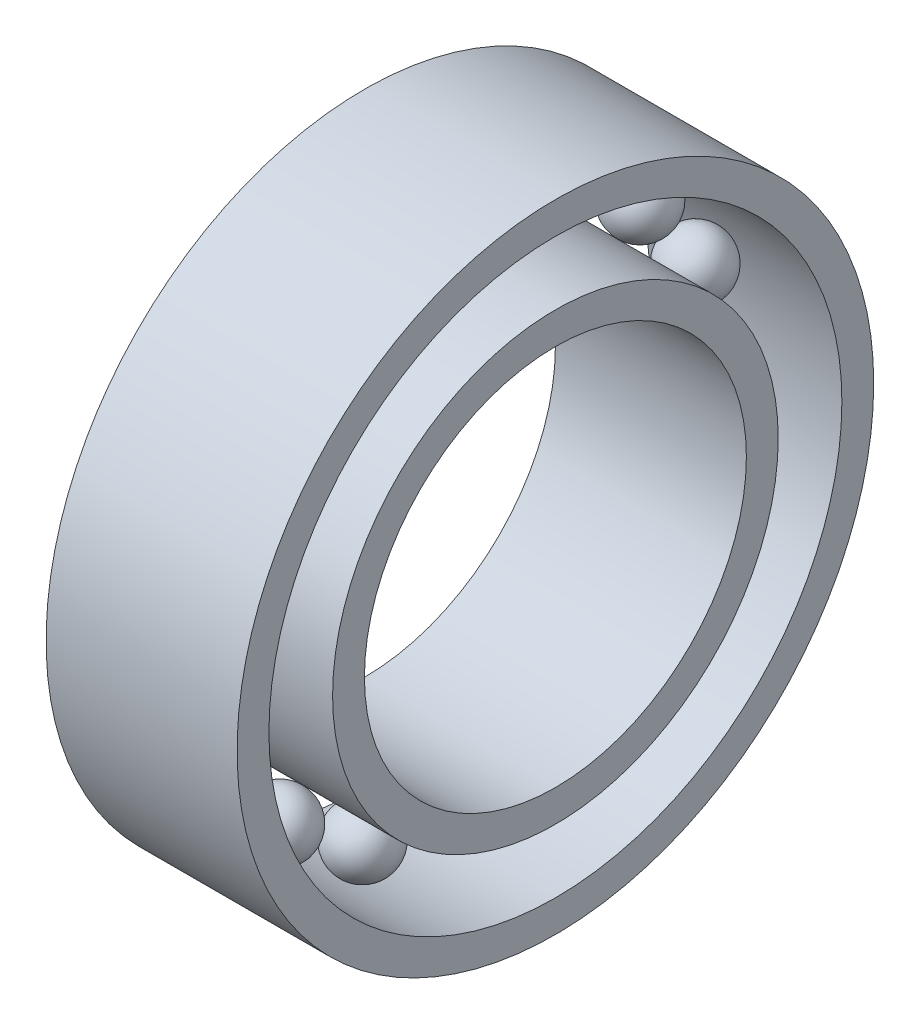
ISO-10303-21;
HEADER;
FILE_DESCRIPTION(('STEP AP214'),'2;1');
FILE_NAME('part.step','',(''),(''),'','','');
FILE_SCHEMA(('AUTOMOTIVE_DESIGN { 1 0 10303 214 1 1 1 1 }'));
ENDSEC;
DATA;
#1=APPLICATION_CONTEXT('core data for automotive mechanical design processes');
#2=APPLICATION_PROTOCOL_DEFINITION('international standard','automotive_design',2000,#1);
#3=PRODUCT_CONTEXT('',#1,'mechanical');
#4=PRODUCT('Part','Part','',(#3));
#5=PRODUCT_RELATED_PRODUCT_CATEGORY('part','',(#4));
#6=PRODUCT_DEFINITION_FORMATION('','',#4);
#7=PRODUCT_DEFINITION_CONTEXT('part definition',#1,'design');
#8=PRODUCT_DEFINITION('design','',#6,#7);
#9=PRODUCT_DEFINITION_SHAPE('','',#8);
#10=(LENGTH_UNIT() NAMED_UNIT(*) SI_UNIT(.MILLI.,.METRE.));
#11=(NAMED_UNIT(*) PLANE_ANGLE_UNIT() SI_UNIT($,.RADIAN.));
#12=(NAMED_UNIT(*) SI_UNIT($,.STERADIAN.) SOLID_ANGLE_UNIT());
#13=UNCERTAINTY_MEASURE_WITH_UNIT(LENGTH_MEASURE(1.E-05),#10,'distance_accuracy_value','');
#14=(GEOMETRIC_REPRESENTATION_CONTEXT(3) GLOBAL_UNCERTAINTY_ASSIGNED_CONTEXT((#13)) GLOBAL_UNIT_ASSIGNED_CONTEXT((#10,
#11,#12)) REPRESENTATION_CONTEXT('',''));
#15=CARTESIAN_POINT('',(0.,0.,0.));
#16=DIRECTION('',(0.,0.,1.));
#17=DIRECTION('',(1.,0.,0.));
#18=AXIS2_PLACEMENT_3D('',#15,#16,#17);
#19=CARTESIAN_POINT('',(0.,3.69551813004517,-1.53073372946031));
#20=DIRECTION('',(0.,-0.923879532511292,0.382683432365077));
#21=DIRECTION('',(0.,0.382683432365077,0.923879532511292));
#22=AXIS2_PLACEMENT_3D('',#19,#20,#21);
#23=SPHERICAL_SURFACE('',#22,0.5);
#24=CARTESIAN_POINT('',(0.,3.23357836378952,-1.33939201327777));
#25=VERTEX_POINT('',#24);
#26=VERTEX_LOOP('',#25);
#27=FACE_BOUND('',#26,.T.);
#28=ADVANCED_FACE('F60',(#27),#23,.T.);
#29=CLOSED_SHELL('',(#28));
#30=MANIFOLD_SOLID_BREP('B2',#29);
#31=CARTESIAN_POINT('',(0.,2.82842712474622,-2.82842712474616));
#32=DIRECTION('',(0.,-0.707106781186556,0.707106781186539));
#33=DIRECTION('',(0.,0.707106781186539,0.707106781186556));
#34=AXIS2_PLACEMENT_3D('',#31,#32,#33);
#35=SPHERICAL_SURFACE('',#34,0.5);
#36=CARTESIAN_POINT('',(0.,2.47487373415295,-2.47487373415289));
#37=VERTEX_POINT('',#36);
#38=VERTEX_LOOP('',#37);
#39=FACE_BOUND('',#38,.T.);
#40=ADVANCED_FACE('F81',(#39),#35,.T.);
#41=CLOSED_SHELL('',(#40));
#42=MANIFOLD_SOLID_BREP('B7',#41);
#43=CARTESIAN_POINT('',(0.,1.5307337294604,-3.69551813004513));
#44=DIRECTION('',(0.,-0.3826834323651,0.923879532511283));
#45=DIRECTION('',(0.,0.923879532511283,0.3826834323651));
#46=AXIS2_PLACEMENT_3D('',#43,#44,#45);
#47=SPHERICAL_SURFACE('',#46,0.5);
#48=CARTESIAN_POINT('',(0.,1.33939201327785,-3.23357836378949));
#49=VERTEX_POINT('',#48);
#50=VERTEX_LOOP('',#49);
#51=FACE_BOUND('',#50,.T.);
#52=ADVANCED_FACE('F99',(#51),#47,.T.);
#53=CLOSED_SHELL('',(#52));
#54=MANIFOLD_SOLID_BREP('B56',#53);
#55=CARTESIAN_POINT('',(0.,0.,-4.));
#56=DIRECTION('',(0.,0.,1.));
#57=DIRECTION('',(0.,1.,0.));
#58=AXIS2_PLACEMENT_3D('',#55,#56,#57);
#59=SPHERICAL_SURFACE('',#58,0.5);
#60=CARTESIAN_POINT('',(0.,0.,-3.5));
#61=VERTEX_POINT('',#60);
#62=VERTEX_LOOP('',#61);
#63=FACE_BOUND('',#62,.T.);
#64=ADVANCED_FACE('F120',(#63),#59,.T.);
#65=CLOSED_SHELL('',(#64));
#66=MANIFOLD_SOLID_BREP('B77',#65);
#67=CARTESIAN_POINT('',(0.,-1.53073372946032,-3.69551813004516));
#68=DIRECTION('',(0.,0.382683432365081,0.923879532511291));
#69=DIRECTION('',(0.,0.923879532511291,-0.382683432365081));
#70=AXIS2_PLACEMENT_3D('',#67,#68,#69);
#71=SPHERICAL_SURFACE('',#70,0.5);
#72=CARTESIAN_POINT('',(0.,-1.33939201327778,-3.23357836378952));
#73=VERTEX_POINT('',#72);
#74=VERTEX_LOOP('',#73);
#75=FACE_BOUND('',#74,.T.);
#76=ADVANCED_FACE('F138',(#75),#71,.T.);
#77=CLOSED_SHELL('',(#76));
#78=MANIFOLD_SOLID_BREP('B95',#77);
#79=CARTESIAN_POINT('',(0.,-2.82842712474617,-2.82842712474621));
#80=DIRECTION('',(0.,0.707106781186541,0.707106781186554));
#81=DIRECTION('',(0.,0.707106781186554,-0.707106781186541));
#82=AXIS2_PLACEMENT_3D('',#79,#80,#81);
#83=SPHERICAL_SURFACE('',#82,0.5);
#84=CARTESIAN_POINT('',(0.,-2.47487373415289,-2.47487373415294));
#85=VERTEX_POINT('',#84);
#86=VERTEX_LOOP('',#85);
#87=FACE_BOUND('',#86,.T.);
#88=ADVANCED_FACE('F159',(#87),#83,.T.);
#89=CLOSED_SHELL('',(#88));
#90=MANIFOLD_SOLID_BREP('B116',#89);
#91=CARTESIAN_POINT('',(0.,-3.69551813004513,-1.53073372946039));
#92=DIRECTION('',(0.,0.923879532511284,0.382683432365097));
#93=DIRECTION('',(0.,0.382683432365097,-0.923879532511284));
#94=AXIS2_PLACEMENT_3D('',#91,#92,#93);
#95=SPHERICAL_SURFACE('',#94,0.5);
#96=CARTESIAN_POINT('',(0.,-3.23357836378949,-1.33939201327784));
#97=VERTEX_POINT('',#96);
#98=VERTEX_LOOP('',#97);
#99=FACE_BOUND('',#98,.T.);
#100=ADVANCED_FACE('F177',(#99),#95,.T.);
#101=CLOSED_SHELL('',(#100));
#102=MANIFOLD_SOLID_BREP('B134',#101);
#103=CARTESIAN_POINT('',(0.,-4.,0.));
#104=DIRECTION('',(0.,1.,0.));
#105=DIRECTION('',(0.,0.,-1.));
#106=AXIS2_PLACEMENT_3D('',#103,#104,#105);
#107=SPHERICAL_SURFACE('',#106,0.5);
#108=CARTESIAN_POINT('',(0.,-3.5,0.));
#109=VERTEX_POINT('',#108);
#110=VERTEX_LOOP('',#109);
#111=FACE_BOUND('',#110,.T.);
#112=ADVANCED_FACE('F195',(#111),#107,.T.);
#113=CLOSED_SHELL('',(#112));
#114=MANIFOLD_SOLID_BREP('B155',#113);
#115=CARTESIAN_POINT('',(0.,-3.69551813004516,1.53073372946034));
#116=DIRECTION('',(0.,0.923879532511289,-0.382683432365084));
#117=DIRECTION('',(0.,-0.382683432365084,-0.923879532511289));
#118=AXIS2_PLACEMENT_3D('',#115,#116,#117);
#119=SPHERICAL_SURFACE('',#118,0.5);
#120=CARTESIAN_POINT('',(0.,-3.23357836378951,1.33939201327779));
#121=VERTEX_POINT('',#120);
#122=VERTEX_LOOP('',#121);
#123=FACE_BOUND('',#122,.T.);
#124=ADVANCED_FACE('F213',(#123),#119,.T.);
#125=CLOSED_SHELL('',(#124));
#126=MANIFOLD_SOLID_BREP('B173',#125);
#127=CARTESIAN_POINT('',(0.,-2.8284271247462,2.82842712474618));
#128=DIRECTION('',(0.,0.707106781186551,-0.707106781186544));
#129=DIRECTION('',(0.,-0.707106781186544,-0.707106781186551));
#130=AXIS2_PLACEMENT_3D('',#127,#128,#129);
#131=SPHERICAL_SURFACE('',#130,0.5);
#132=CARTESIAN_POINT('',(0.,-2.47487373415293,2.4748737341529));
#133=VERTEX_POINT('',#132);
#134=VERTEX_LOOP('',#133);
#135=FACE_BOUND('',#134,.T.);
#136=ADVANCED_FACE('F231',(#135),#131,.T.);
#137=CLOSED_SHELL('',(#136));
#138=MANIFOLD_SOLID_BREP('B191',#137);
#139=CARTESIAN_POINT('',(0.,-1.53073372946038,3.69551813004514));
#140=DIRECTION('',(0.,0.382683432365094,-0.923879532511285));
#141=DIRECTION('',(0.,-0.923879532511285,-0.382683432365094));
#142=AXIS2_PLACEMENT_3D('',#139,#140,#141);
#143=SPHERICAL_SURFACE('',#142,0.5);
#144=CARTESIAN_POINT('',(0.,-1.33939201327783,3.2335783637895));
#145=VERTEX_POINT('',#144);
#146=VERTEX_LOOP('',#145);
#147=FACE_BOUND('',#146,.T.);
#148=ADVANCED_FACE('F249',(#147),#143,.T.);
#149=CLOSED_SHELL('',(#148));
#150=MANIFOLD_SOLID_BREP('B209',#149);
#151=CARTESIAN_POINT('',(0.,0.,4.));
#152=DIRECTION('',(0.,0.,-1.));
#153=DIRECTION('',(0.,-1.,0.));
#154=AXIS2_PLACEMENT_3D('',#151,#152,#153);
#155=SPHERICAL_SURFACE('',#154,0.5);
#156=CARTESIAN_POINT('',(0.,0.,3.5));
#157=VERTEX_POINT('',#156);
#158=VERTEX_LOOP('',#157);
#159=FACE_BOUND('',#158,.T.);
#160=ADVANCED_FACE('F267',(#159),#155,.T.);
#161=CLOSED_SHELL('',(#160));
#162=MANIFOLD_SOLID_BREP('B227',#161);
#163=CARTESIAN_POINT('',(0.,1.53073372946035,3.69551813004515));
#164=DIRECTION('',(0.,-0.382683432365087,-0.923879532511288));
#165=DIRECTION('',(0.,-0.923879532511288,0.382683432365087));
#166=AXIS2_PLACEMENT_3D('',#163,#164,#165);
#167=SPHERICAL_SURFACE('',#166,0.5);
#168=CARTESIAN_POINT('',(0.,1.33939201327781,3.23357836378951));
#169=VERTEX_POINT('',#168);
#170=VERTEX_LOOP('',#169);
#171=FACE_BOUND('',#170,.T.);
#172=ADVANCED_FACE('F285',(#171),#167,.T.);
#173=CLOSED_SHELL('',(#172));
#174=MANIFOLD_SOLID_BREP('B245',#173);
#175=CARTESIAN_POINT('',(0.,2.82842712474619,2.8284271247462));
#176=DIRECTION('',(0.,-0.707106781186546,-0.707106781186549));
#177=DIRECTION('',(0.,-0.707106781186549,0.707106781186546));
#178=AXIS2_PLACEMENT_3D('',#175,#176,#177);
#179=SPHERICAL_SURFACE('',#178,0.5);
#180=CARTESIAN_POINT('',(0.,2.47487373415291,2.47487373415292));
#181=VERTEX_POINT('',#180);
#182=VERTEX_LOOP('',#181);
#183=FACE_BOUND('',#182,.T.);
#184=ADVANCED_FACE('F303',(#183),#179,.T.);
#185=CLOSED_SHELL('',(#184));
#186=MANIFOLD_SOLID_BREP('B263',#185);
#187=CARTESIAN_POINT('',(0.,3.69551813004515,1.53073372946036));
#188=DIRECTION('',(0.,-0.923879532511287,-0.382683432365091));
#189=DIRECTION('',(0.,-0.382683432365091,0.923879532511287));
#190=AXIS2_PLACEMENT_3D('',#187,#188,#189);
#191=SPHERICAL_SURFACE('',#190,0.5);
#192=CARTESIAN_POINT('',(0.,3.2335783637895,1.33939201327782));
#193=VERTEX_POINT('',#192);
#194=VERTEX_LOOP('',#193);
#195=FACE_BOUND('',#194,.T.);
#196=ADVANCED_FACE('F324',(#195),#191,.T.);
#197=CLOSED_SHELL('',(#196));
#198=MANIFOLD_SOLID_BREP('B281',#197);
#199=CARTESIAN_POINT('',(0.,4.,0.));
#200=DIRECTION('',(0.,-1.,0.));
#201=DIRECTION('',(0.,0.,1.));
#202=AXIS2_PLACEMENT_3D('',#199,#200,#201);
#203=SPHERICAL_SURFACE('',#202,0.5);
#204=CARTESIAN_POINT('',(0.,3.5,0.));
#205=VERTEX_POINT('',#204);
#206=VERTEX_LOOP('',#205);
#207=FACE_BOUND('',#206,.T.);
#208=ADVANCED_FACE('F346',(#207),#203,.T.);
#209=CLOSED_SHELL('',(#208));
#210=MANIFOLD_SOLID_BREP('B299',#209);
#211=CARTESIAN_POINT('',(-1.5,0.,0.));
#212=DIRECTION('',(1.,0.,0.));
#213=DIRECTION('',(0.,0.,-1.));
#214=AXIS2_PLACEMENT_3D('',#211,#212,#213);
#215=CYLINDRICAL_SURFACE('',#214,3.);
#216=CARTESIAN_POINT('',(-1.5,0.,0.));
#217=DIRECTION('',(1.,0.,0.));
#218=DIRECTION('',(0.,0.,-1.));
#219=AXIS2_PLACEMENT_3D('',#216,#217,#218);
#220=CIRCLE('',#219,3.);
#221=CARTESIAN_POINT('',(-1.5,0.,-3.));
#222=VERTEX_POINT('',#221);
#223=EDGE_CURVE('E376',#222,#222,#220,.T.);
#224=ORIENTED_EDGE('',*,*,#223,.F.);
#225=EDGE_LOOP('',(#224));
#226=FACE_BOUND('',#225,.T.);
#227=CARTESIAN_POINT('',(1.5,0.,0.));
#228=DIRECTION('',(1.,0.,0.));
#229=DIRECTION('',(0.,0.,-1.));
#230=AXIS2_PLACEMENT_3D('',#227,#228,#229);
#231=CIRCLE('',#230,3.);
#232=CARTESIAN_POINT('',(1.5,0.,-3.));
#233=VERTEX_POINT('',#232);
#234=EDGE_CURVE('E389',#233,#233,#231,.T.);
#235=ORIENTED_EDGE('',*,*,#234,.T.);
#236=EDGE_LOOP('',(#235));
#237=FACE_BOUND('',#236,.T.);
#238=ADVANCED_FACE('F370',(#226,#237),#215,.F.);
#239=CARTESIAN_POINT('',(-1.5,0.,0.));
#240=DIRECTION('',(1.,0.,0.));
#241=DIRECTION('',(0.,0.,-1.));
#242=AXIS2_PLACEMENT_3D('',#239,#240,#241);
#243=CYLINDRICAL_SURFACE('',#242,3.5);
#244=CARTESIAN_POINT('',(0.,3.5,0.));
#245=VERTEX_POINT('',#244);
#246=VERTEX_LOOP('',#245);
#247=FACE_BOUND('',#246,.T.);
#248=CARTESIAN_POINT('',(-1.5,0.,0.));
#249=DIRECTION('',(1.,0.,0.));
#250=DIRECTION('',(0.,0.,-1.));
#251=AXIS2_PLACEMENT_3D('',#248,#249,#250);
#252=CIRCLE('',#251,3.5);
#253=CARTESIAN_POINT('',(-1.5,0.,-3.5));
#254=VERTEX_POINT('',#253);
#255=EDGE_CURVE('E344',#254,#254,#252,.T.);
#256=ORIENTED_EDGE('',*,*,#255,.T.);
#257=EDGE_LOOP('',(#256));
#258=FACE_BOUND('',#257,.T.);
#259=CARTESIAN_POINT('',(1.5,0.,0.));
#260=DIRECTION('',(1.,0.,0.));
#261=DIRECTION('',(0.,0.,-1.));
#262=AXIS2_PLACEMENT_3D('',#259,#260,#261);
#263=CIRCLE('',#262,3.5);
#264=CARTESIAN_POINT('',(1.5,0.,-3.5));
#265=VERTEX_POINT('',#264);
#266=EDGE_CURVE('E387',#265,#265,#263,.T.);
#267=ORIENTED_EDGE('',*,*,#266,.F.);
#268=EDGE_LOOP('',(#267));
#269=FACE_BOUND('',#268,.T.);
#270=ADVANCED_FACE('F379',(#247,#258,#269),#243,.T.);
#271=CARTESIAN_POINT('',(-1.5,0.,0.));
#272=DIRECTION('',(1.,0.,0.));
#273=DIRECTION('',(0.,0.,-1.));
#274=AXIS2_PLACEMENT_3D('',#271,#272,#273);
#275=PLANE('',#274);
#276=ORIENTED_EDGE('',*,*,#223,.T.);
#277=EDGE_LOOP('',(#276));
#278=FACE_BOUND('',#277,.T.);
#279=ORIENTED_EDGE('',*,*,#255,.F.);
#280=EDGE_LOOP('',(#279));
#281=FACE_BOUND('',#280,.T.);
#282=ADVANCED_FACE('F382',(#278,#281),#275,.F.);
#283=CARTESIAN_POINT('',(1.5,0.,0.));
#284=DIRECTION('',(1.,0.,0.));
#285=DIRECTION('',(0.,0.,-1.));
#286=AXIS2_PLACEMENT_3D('',#283,#284,#285);
#287=PLANE('',#286);
#288=ORIENTED_EDGE('',*,*,#234,.F.);
#289=EDGE_LOOP('',(#288));
#290=FACE_BOUND('',#289,.T.);
#291=ORIENTED_EDGE('',*,*,#266,.T.);
#292=EDGE_LOOP('',(#291));
#293=FACE_BOUND('',#292,.T.);
#294=ADVANCED_FACE('F397',(#290,#293),#287,.T.);
#295=CLOSED_SHELL('',(#238,#270,#282,#294));
#296=MANIFOLD_SOLID_BREP('B320',#295);
#297=CARTESIAN_POINT('',(-1.5,0.,0.));
#298=DIRECTION('',(1.,0.,0.));
#299=DIRECTION('',(0.,0.,-1.));
#300=AXIS2_PLACEMENT_3D('',#297,#298,#299);
#301=CYLINDRICAL_SURFACE('',#300,4.5);
#302=CARTESIAN_POINT('',(0.,4.5,0.));
#303=VERTEX_POINT('',#302);
#304=VERTEX_LOOP('',#303);
#305=FACE_BOUND('',#304,.T.);
#306=CARTESIAN_POINT('',(-1.5,0.,0.));
#307=DIRECTION('',(1.,0.,0.));
#308=DIRECTION('',(0.,0.,-1.));
#309=AXIS2_PLACEMENT_3D('',#306,#307,#308);
#310=CIRCLE('',#309,4.5);
#311=CARTESIAN_POINT('',(-1.5,0.,-4.5));
#312=VERTEX_POINT('',#311);
#313=EDGE_CURVE('E440',#312,#312,#310,.T.);
#314=ORIENTED_EDGE('',*,*,#313,.F.);
#315=EDGE_LOOP('',(#314));
#316=FACE_BOUND('',#315,.T.);
#317=CARTESIAN_POINT('',(1.5,0.,0.));
#318=DIRECTION('',(1.,0.,0.));
#319=DIRECTION('',(0.,0.,-1.));
#320=AXIS2_PLACEMENT_3D('',#317,#318,#319);
#321=CIRCLE('',#320,4.5);
#322=CARTESIAN_POINT('',(1.5,0.,-4.5));
#323=VERTEX_POINT('',#322);
#324=EDGE_CURVE('E451',#323,#323,#321,.T.);
#325=ORIENTED_EDGE('',*,*,#324,.T.);
#326=EDGE_LOOP('',(#325));
#327=FACE_BOUND('',#326,.T.);
#328=ADVANCED_FACE('F433',(#305,#316,#327),#301,.F.);
#329=CARTESIAN_POINT('',(-1.5,0.,0.));
#330=DIRECTION('',(1.,0.,0.));
#331=DIRECTION('',(0.,0.,-1.));
#332=AXIS2_PLACEMENT_3D('',#329,#330,#331);
#333=CYLINDRICAL_SURFACE('',#332,5.);
#334=CARTESIAN_POINT('',(-1.5,0.,0.));
#335=DIRECTION('',(1.,0.,0.));
#336=DIRECTION('',(0.,0.,-1.));
#337=AXIS2_PLACEMENT_3D('',#334,#335,#336);
#338=CIRCLE('',#337,5.);
#339=CARTESIAN_POINT('',(-1.5,0.,-5.));
#340=VERTEX_POINT('',#339);
#341=EDGE_CURVE('E368',#340,#340,#338,.T.);
#342=ORIENTED_EDGE('',*,*,#341,.T.);
#343=EDGE_LOOP('',(#342));
#344=FACE_BOUND('',#343,.T.);
#345=CARTESIAN_POINT('',(1.5,0.,0.));
#346=DIRECTION('',(1.,0.,0.));
#347=DIRECTION('',(0.,0.,-1.));
#348=AXIS2_PLACEMENT_3D('',#345,#346,#347);
#349=CIRCLE('',#348,5.);
#350=CARTESIAN_POINT('',(1.5,0.,-5.));
#351=VERTEX_POINT('',#350);
#352=EDGE_CURVE('E454',#351,#351,#349,.T.);
#353=ORIENTED_EDGE('',*,*,#352,.F.);
#354=EDGE_LOOP('',(#353));
#355=FACE_BOUND('',#354,.T.);
#356=ADVANCED_FACE('F445',(#344,#355),#333,.T.);
#357=CARTESIAN_POINT('',(-1.5,0.,0.));
#358=DIRECTION('',(1.,0.,0.));
#359=DIRECTION('',(0.,0.,-1.));
#360=AXIS2_PLACEMENT_3D('',#357,#358,#359);
#361=PLANE('',#360);
#362=ORIENTED_EDGE('',*,*,#313,.T.);
#363=EDGE_LOOP('',(#362));
#364=FACE_BOUND('',#363,.T.);
#365=ORIENTED_EDGE('',*,*,#341,.F.);
#366=EDGE_LOOP('',(#365));
#367=FACE_BOUND('',#366,.T.);
#368=ADVANCED_FACE('F461',(#364,#367),#361,.F.);
#369=CARTESIAN_POINT('',(1.5,0.,0.));
#370=DIRECTION('',(1.,0.,0.));
#371=DIRECTION('',(0.,0.,-1.));
#372=AXIS2_PLACEMENT_3D('',#369,#370,#371);
#373=PLANE('',#372);
#374=ORIENTED_EDGE('',*,*,#324,.F.);
#375=EDGE_LOOP('',(#374));
#376=FACE_BOUND('',#375,.T.);
#377=ORIENTED_EDGE('',*,*,#352,.T.);
#378=EDGE_LOOP('',(#377));
#379=FACE_BOUND('',#378,.T.);
#380=ADVANCED_FACE('F464',(#376,#379),#373,.T.);
#381=CLOSED_SHELL('',(#328,#356,#368,#380));
#382=MANIFOLD_SOLID_BREP('B338',#381);
#383=ADVANCED_BREP_SHAPE_REPRESENTATION('',(#18,#30,#42,#54,#66,#78,#90,#102,#114,#126,#138,
#150,#162,#174,#186,#198,#210,#296,#382),#14);
#384=SHAPE_DEFINITION_REPRESENTATION(#9,#383);
ENDSEC;
END-ISO-10303-21;
